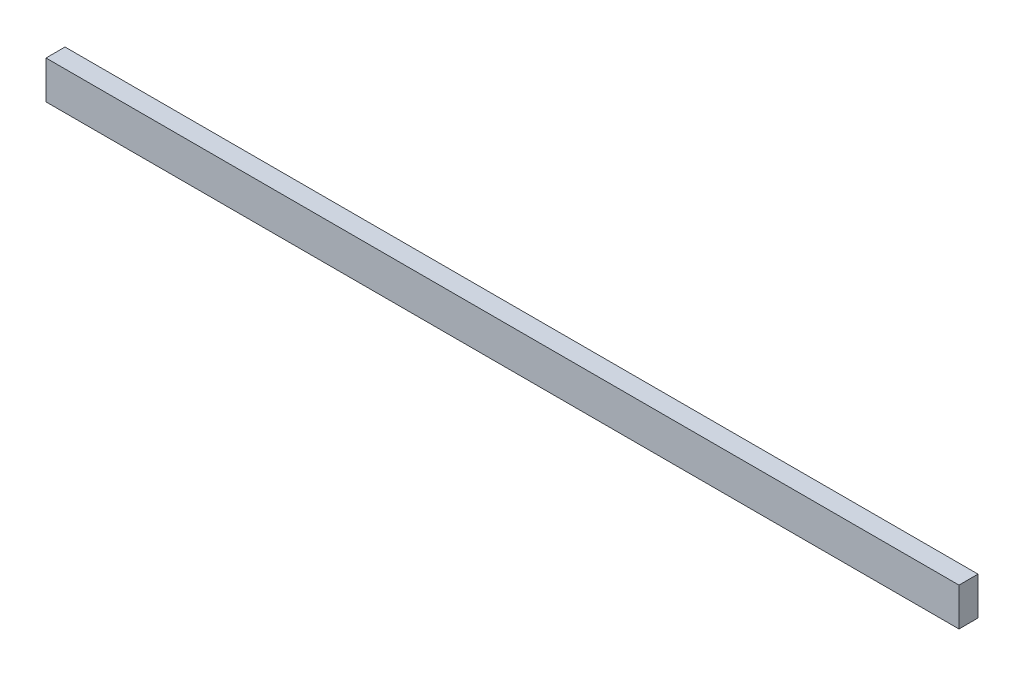
ISO-10303-21;
HEADER;
FILE_DESCRIPTION(('STEP AP214'),'2;1');
FILE_NAME('part.step','',(''),(''),'','','');
FILE_SCHEMA(('AUTOMOTIVE_DESIGN { 1 0 10303 214 1 1 1 1 }'));
ENDSEC;
DATA;
#1=APPLICATION_CONTEXT('core data for automotive mechanical design processes');
#2=APPLICATION_PROTOCOL_DEFINITION('international standard','automotive_design',2000,#1);
#3=PRODUCT_CONTEXT('',#1,'mechanical');
#4=PRODUCT('Part','Part','',(#3));
#5=PRODUCT_RELATED_PRODUCT_CATEGORY('part','',(#4));
#6=PRODUCT_DEFINITION_FORMATION('','',#4);
#7=PRODUCT_DEFINITION_CONTEXT('part definition',#1,'design');
#8=PRODUCT_DEFINITION('design','',#6,#7);
#9=PRODUCT_DEFINITION_SHAPE('','',#8);
#10=(LENGTH_UNIT() NAMED_UNIT(*) SI_UNIT(.MILLI.,.METRE.));
#11=(NAMED_UNIT(*) PLANE_ANGLE_UNIT() SI_UNIT($,.RADIAN.));
#12=(NAMED_UNIT(*) SI_UNIT($,.STERADIAN.) SOLID_ANGLE_UNIT());
#13=UNCERTAINTY_MEASURE_WITH_UNIT(LENGTH_MEASURE(1.E-05),#10,'distance_accuracy_value','');
#14=(GEOMETRIC_REPRESENTATION_CONTEXT(3) GLOBAL_UNCERTAINTY_ASSIGNED_CONTEXT((#13)) GLOBAL_UNIT_ASSIGNED_CONTEXT((#10,
#11,#12)) REPRESENTATION_CONTEXT('',''));
#15=CARTESIAN_POINT('',(0.,0.,0.));
#16=DIRECTION('',(0.,0.,1.));
#17=DIRECTION('',(1.,0.,0.));
#18=AXIS2_PLACEMENT_3D('',#15,#16,#17);
#19=CARTESIAN_POINT('',(1219.2,-50.8,50.8));
#20=DIRECTION('',(-1.,0.,0.));
#21=DIRECTION('',(0.,0.,1.));
#22=AXIS2_PLACEMENT_3D('',#19,#20,#21);
#23=PLANE('',#22);
#24=DIRECTION('',(0.,1.,0.));
#25=VECTOR('',#24,1.);
#26=CARTESIAN_POINT('',(1219.2,-50.8,0.));
#27=LINE('',#26,#25);
#28=CARTESIAN_POINT('',(1219.2,-50.8,0.));
#29=VERTEX_POINT('',#28);
#30=CARTESIAN_POINT('',(1219.2,50.8,0.));
#31=VERTEX_POINT('',#30);
#32=EDGE_CURVE('E96',#29,#31,#27,.T.);
#33=ORIENTED_EDGE('',*,*,#32,.T.);
#34=DIRECTION('',(0.,0.,-1.));
#35=VECTOR('',#34,1.);
#36=CARTESIAN_POINT('',(1219.2,50.8,50.8));
#37=LINE('',#36,#35);
#38=CARTESIAN_POINT('',(1219.2,50.8,50.8));
#39=VERTEX_POINT('',#38);
#40=EDGE_CURVE('E11',#39,#31,#37,.T.);
#41=ORIENTED_EDGE('',*,*,#40,.F.);
#42=DIRECTION('',(0.,1.,0.));
#43=VECTOR('',#42,1.);
#44=CARTESIAN_POINT('',(1219.2,-50.8,50.8));
#45=LINE('',#44,#43);
#46=CARTESIAN_POINT('',(1219.2,-50.8,50.8));
#47=VERTEX_POINT('',#46);
#48=EDGE_CURVE('E84',#47,#39,#45,.T.);
#49=ORIENTED_EDGE('',*,*,#48,.F.);
#50=DIRECTION('',(0.,0.,-1.));
#51=VECTOR('',#50,1.);
#52=CARTESIAN_POINT('',(1219.2,-50.8,50.8));
#53=LINE('',#52,#51);
#54=EDGE_CURVE('E92',#47,#29,#53,.T.);
#55=ORIENTED_EDGE('',*,*,#54,.T.);
#56=EDGE_LOOP('',(#33,#41,#49,#55));
#57=FACE_BOUND('',#56,.T.);
#58=ADVANCED_FACE('F33',(#57),#23,.F.);
#59=CARTESIAN_POINT('',(-1219.2,50.8,50.8));
#60=DIRECTION('',(0.,-1.,0.));
#61=DIRECTION('',(0.,0.,-1.));
#62=AXIS2_PLACEMENT_3D('',#59,#60,#61);
#63=PLANE('',#62);
#64=DIRECTION('',(-1.,0.,0.));
#65=VECTOR('',#64,1.);
#66=CARTESIAN_POINT('',(-1219.2,50.8,0.));
#67=LINE('',#66,#65);
#68=CARTESIAN_POINT('',(-1219.2,50.8,0.));
#69=VERTEX_POINT('',#68);
#70=EDGE_CURVE('E88',#31,#69,#67,.T.);
#71=ORIENTED_EDGE('',*,*,#70,.T.);
#72=DIRECTION('',(0.,0.,-1.));
#73=VECTOR('',#72,1.);
#74=CARTESIAN_POINT('',(-1219.2,50.8,50.8));
#75=LINE('',#74,#73);
#76=CARTESIAN_POINT('',(-1219.2,50.8,50.8));
#77=VERTEX_POINT('',#76);
#78=EDGE_CURVE('E41',#77,#69,#75,.T.);
#79=ORIENTED_EDGE('',*,*,#78,.F.);
#80=DIRECTION('',(-1.,0.,0.));
#81=VECTOR('',#80,1.);
#82=CARTESIAN_POINT('',(-1219.2,50.8,50.8));
#83=LINE('',#82,#81);
#84=EDGE_CURVE('E79',#39,#77,#83,.T.);
#85=ORIENTED_EDGE('',*,*,#84,.F.);
#86=ORIENTED_EDGE('',*,*,#40,.T.);
#87=EDGE_LOOP('',(#71,#79,#85,#86));
#88=FACE_BOUND('',#87,.T.);
#89=ADVANCED_FACE('F87',(#88),#63,.F.);
#90=CARTESIAN_POINT('',(-1219.2,-50.8,50.8));
#91=DIRECTION('',(1.,0.,0.));
#92=DIRECTION('',(0.,0.,-1.));
#93=AXIS2_PLACEMENT_3D('',#90,#91,#92);
#94=PLANE('',#93);
#95=DIRECTION('',(0.,-1.,0.));
#96=VECTOR('',#95,1.);
#97=CARTESIAN_POINT('',(-1219.2,-50.8,0.));
#98=LINE('',#97,#96);
#99=CARTESIAN_POINT('',(-1219.2,-50.8,0.));
#100=VERTEX_POINT('',#99);
#101=EDGE_CURVE('E66',#69,#100,#98,.T.);
#102=ORIENTED_EDGE('',*,*,#101,.T.);
#103=DIRECTION('',(0.,0.,-1.));
#104=VECTOR('',#103,1.);
#105=CARTESIAN_POINT('',(-1219.2,-50.8,50.8));
#106=LINE('',#105,#104);
#107=CARTESIAN_POINT('',(-1219.2,-50.8,50.8));
#108=VERTEX_POINT('',#107);
#109=EDGE_CURVE('E89',#108,#100,#106,.T.);
#110=ORIENTED_EDGE('',*,*,#109,.F.);
#111=DIRECTION('',(0.,-1.,0.));
#112=VECTOR('',#111,1.);
#113=CARTESIAN_POINT('',(-1219.2,-50.8,50.8));
#114=LINE('',#113,#112);
#115=EDGE_CURVE('E82',#77,#108,#114,.T.);
#116=ORIENTED_EDGE('',*,*,#115,.F.);
#117=ORIENTED_EDGE('',*,*,#78,.T.);
#118=EDGE_LOOP('',(#102,#110,#116,#117));
#119=FACE_BOUND('',#118,.T.);
#120=ADVANCED_FACE('F90',(#119),#94,.F.);
#121=CARTESIAN_POINT('',(-1219.2,-50.8,50.8));
#122=DIRECTION('',(0.,1.,0.));
#123=DIRECTION('',(0.,0.,1.));
#124=AXIS2_PLACEMENT_3D('',#121,#122,#123);
#125=PLANE('',#124);
#126=DIRECTION('',(1.,0.,0.));
#127=VECTOR('',#126,1.);
#128=CARTESIAN_POINT('',(-1219.2,-50.8,0.));
#129=LINE('',#128,#127);
#130=EDGE_CURVE('E72',#100,#29,#129,.T.);
#131=ORIENTED_EDGE('',*,*,#130,.T.);
#132=ORIENTED_EDGE('',*,*,#54,.F.);
#133=DIRECTION('',(1.,0.,0.));
#134=VECTOR('',#133,1.);
#135=CARTESIAN_POINT('',(-1219.2,-50.8,50.8));
#136=LINE('',#135,#134);
#137=EDGE_CURVE('E49',#108,#47,#136,.T.);
#138=ORIENTED_EDGE('',*,*,#137,.F.);
#139=ORIENTED_EDGE('',*,*,#109,.T.);
#140=EDGE_LOOP('',(#131,#132,#138,#139));
#141=FACE_BOUND('',#140,.T.);
#142=ADVANCED_FACE('F103',(#141),#125,.F.);
#143=CARTESIAN_POINT('',(0.,0.,50.8));
#144=DIRECTION('',(0.,0.,-1.));
#145=DIRECTION('',(-1.,0.,0.));
#146=AXIS2_PLACEMENT_3D('',#143,#144,#145);
#147=PLANE('',#146);
#148=ORIENTED_EDGE('',*,*,#48,.T.);
#149=ORIENTED_EDGE('',*,*,#84,.T.);
#150=ORIENTED_EDGE('',*,*,#115,.T.);
#151=ORIENTED_EDGE('',*,*,#137,.T.);
#152=EDGE_LOOP('',(#148,#149,#150,#151));
#153=FACE_BOUND('',#152,.T.);
#154=ADVANCED_FACE('F80',(#153),#147,.F.);
#155=CARTESIAN_POINT('',(0.,0.,0.));
#156=DIRECTION('',(0.,0.,-1.));
#157=DIRECTION('',(-1.,0.,0.));
#158=AXIS2_PLACEMENT_3D('',#155,#156,#157);
#159=PLANE('',#158);
#160=ORIENTED_EDGE('',*,*,#32,.F.);
#161=ORIENTED_EDGE('',*,*,#130,.F.);
#162=ORIENTED_EDGE('',*,*,#101,.F.);
#163=ORIENTED_EDGE('',*,*,#70,.F.);
#164=EDGE_LOOP('',(#160,#161,#162,#163));
#165=FACE_BOUND('',#164,.T.);
#166=ADVANCED_FACE('F106',(#165),#159,.T.);
#167=CLOSED_SHELL('',(#58,#89,#120,#142,#154,#166));
#168=MANIFOLD_SOLID_BREP('B2',#167);
#169=ADVANCED_BREP_SHAPE_REPRESENTATION('',(#18,#168),#14);
#170=SHAPE_DEFINITION_REPRESENTATION(#9,#169);
ENDSEC;
END-ISO-10303-21;
